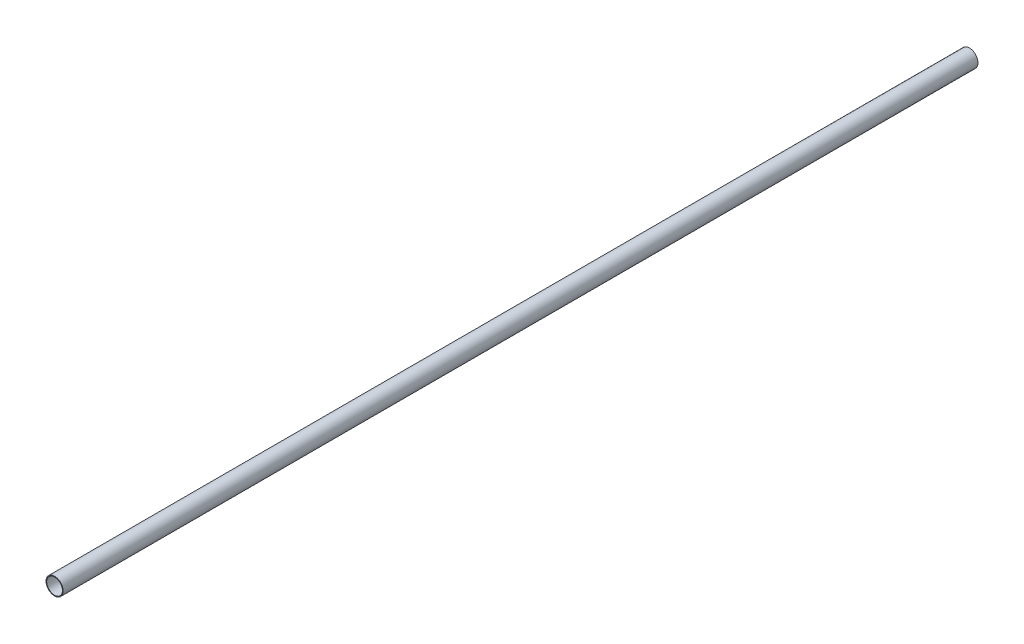
ISO-10303-21;
HEADER;
FILE_DESCRIPTION(('STEP AP214'),'2;1');
FILE_NAME('part.step','',(''),(''),'','','');
FILE_SCHEMA(('AUTOMOTIVE_DESIGN { 1 0 10303 214 1 1 1 1 }'));
ENDSEC;
DATA;
#1=APPLICATION_CONTEXT('core data for automotive mechanical design processes');
#2=APPLICATION_PROTOCOL_DEFINITION('international standard','automotive_design',2000,#1);
#3=PRODUCT_CONTEXT('',#1,'mechanical');
#4=PRODUCT('Part','Part','',(#3));
#5=PRODUCT_RELATED_PRODUCT_CATEGORY('part','',(#4));
#6=PRODUCT_DEFINITION_FORMATION('','',#4);
#7=PRODUCT_DEFINITION_CONTEXT('part definition',#1,'design');
#8=PRODUCT_DEFINITION('design','',#6,#7);
#9=PRODUCT_DEFINITION_SHAPE('','',#8);
#10=(LENGTH_UNIT() NAMED_UNIT(*) SI_UNIT(.MILLI.,.METRE.));
#11=(NAMED_UNIT(*) PLANE_ANGLE_UNIT() SI_UNIT($,.RADIAN.));
#12=(NAMED_UNIT(*) SI_UNIT($,.STERADIAN.) SOLID_ANGLE_UNIT());
#13=UNCERTAINTY_MEASURE_WITH_UNIT(LENGTH_MEASURE(1.E-05),#10,'distance_accuracy_value','');
#14=(GEOMETRIC_REPRESENTATION_CONTEXT(3) GLOBAL_UNCERTAINTY_ASSIGNED_CONTEXT((#13)) GLOBAL_UNIT_ASSIGNED_CONTEXT((#10,
#11,#12)) REPRESENTATION_CONTEXT('',''));
#15=CARTESIAN_POINT('',(0.,0.,0.));
#16=DIRECTION('',(0.,0.,1.));
#17=DIRECTION('',(1.,0.,0.));
#18=AXIS2_PLACEMENT_3D('',#15,#16,#17);
#19=CARTESIAN_POINT('',(0.,0.,800.));
#20=DIRECTION('',(0.,0.,1.));
#21=DIRECTION('',(1.,0.,0.));
#22=AXIS2_PLACEMENT_3D('',#19,#20,#21);
#23=PLANE('',#22);
#24=CARTESIAN_POINT('',(0.,0.,800.));
#25=DIRECTION('',(0.,0.,1.));
#26=DIRECTION('',(1.,0.,0.));
#27=AXIS2_PLACEMENT_3D('',#24,#25,#26);
#28=CIRCLE('',#27,7.5);
#29=CARTESIAN_POINT('',(7.5,0.,800.));
#30=VERTEX_POINT('',#29);
#31=EDGE_CURVE('E10',#30,#30,#28,.T.);
#32=ORIENTED_EDGE('',*,*,#31,.T.);
#33=EDGE_LOOP('',(#32));
#34=FACE_BOUND('',#33,.T.);
#35=CARTESIAN_POINT('',(0.,0.,800.));
#36=DIRECTION('',(0.,0.,1.));
#37=DIRECTION('',(1.,0.,0.));
#38=AXIS2_PLACEMENT_3D('',#35,#36,#37);
#39=CIRCLE('',#38,6.9);
#40=CARTESIAN_POINT('',(6.9,0.,800.));
#41=VERTEX_POINT('',#40);
#42=EDGE_CURVE('E52',#41,#41,#39,.T.);
#43=ORIENTED_EDGE('',*,*,#42,.F.);
#44=EDGE_LOOP('',(#43));
#45=FACE_BOUND('',#44,.T.);
#46=ADVANCED_FACE('F41',(#34,#45),#23,.T.);
#47=CARTESIAN_POINT('',(0.,0.,0.));
#48=DIRECTION('',(0.,0.,1.));
#49=DIRECTION('',(1.,0.,0.));
#50=AXIS2_PLACEMENT_3D('',#47,#48,#49);
#51=PLANE('',#50);
#52=CARTESIAN_POINT('',(0.,0.,0.));
#53=DIRECTION('',(0.,0.,1.));
#54=DIRECTION('',(1.,0.,0.));
#55=AXIS2_PLACEMENT_3D('',#52,#53,#54);
#56=CIRCLE('',#55,7.5);
#57=CARTESIAN_POINT('',(7.5,0.,0.));
#58=VERTEX_POINT('',#57);
#59=EDGE_CURVE('E45',#58,#58,#56,.T.);
#60=ORIENTED_EDGE('',*,*,#59,.F.);
#61=EDGE_LOOP('',(#60));
#62=FACE_BOUND('',#61,.T.);
#63=CARTESIAN_POINT('',(0.,0.,0.));
#64=DIRECTION('',(0.,0.,1.));
#65=DIRECTION('',(1.,0.,0.));
#66=AXIS2_PLACEMENT_3D('',#63,#64,#65);
#67=CIRCLE('',#66,6.9);
#68=CARTESIAN_POINT('',(6.9,0.,0.));
#69=VERTEX_POINT('',#68);
#70=EDGE_CURVE('E54',#69,#69,#67,.T.);
#71=ORIENTED_EDGE('',*,*,#70,.T.);
#72=EDGE_LOOP('',(#71));
#73=FACE_BOUND('',#72,.T.);
#74=ADVANCED_FACE('F64',(#62,#73),#51,.F.);
#75=CARTESIAN_POINT('',(0.,0.,800.));
#76=DIRECTION('',(0.,0.,-1.));
#77=DIRECTION('',(-1.,0.,0.));
#78=AXIS2_PLACEMENT_3D('',#75,#76,#77);
#79=CYLINDRICAL_SURFACE('',#78,7.5);
#80=ORIENTED_EDGE('',*,*,#31,.F.);
#81=EDGE_LOOP('',(#80));
#82=FACE_BOUND('',#81,.T.);
#83=ORIENTED_EDGE('',*,*,#59,.T.);
#84=EDGE_LOOP('',(#83));
#85=FACE_BOUND('',#84,.T.);
#86=ADVANCED_FACE('F43',(#82,#85),#79,.T.);
#87=CARTESIAN_POINT('',(0.,0.,800.));
#88=DIRECTION('',(0.,0.,-1.));
#89=DIRECTION('',(-1.,0.,0.));
#90=AXIS2_PLACEMENT_3D('',#87,#88,#89);
#91=CYLINDRICAL_SURFACE('',#90,6.9);
#92=ORIENTED_EDGE('',*,*,#42,.T.);
#93=EDGE_LOOP('',(#92));
#94=FACE_BOUND('',#93,.T.);
#95=ORIENTED_EDGE('',*,*,#70,.F.);
#96=EDGE_LOOP('',(#95));
#97=FACE_BOUND('',#96,.T.);
#98=ADVANCED_FACE('F60',(#94,#97),#91,.F.);
#99=CLOSED_SHELL('',(#46,#74,#86,#98));
#100=MANIFOLD_SOLID_BREP('B2',#99);
#101=ADVANCED_BREP_SHAPE_REPRESENTATION('',(#18,#100),#14);
#102=SHAPE_DEFINITION_REPRESENTATION(#9,#101);
ENDSEC;
END-ISO-10303-21;
